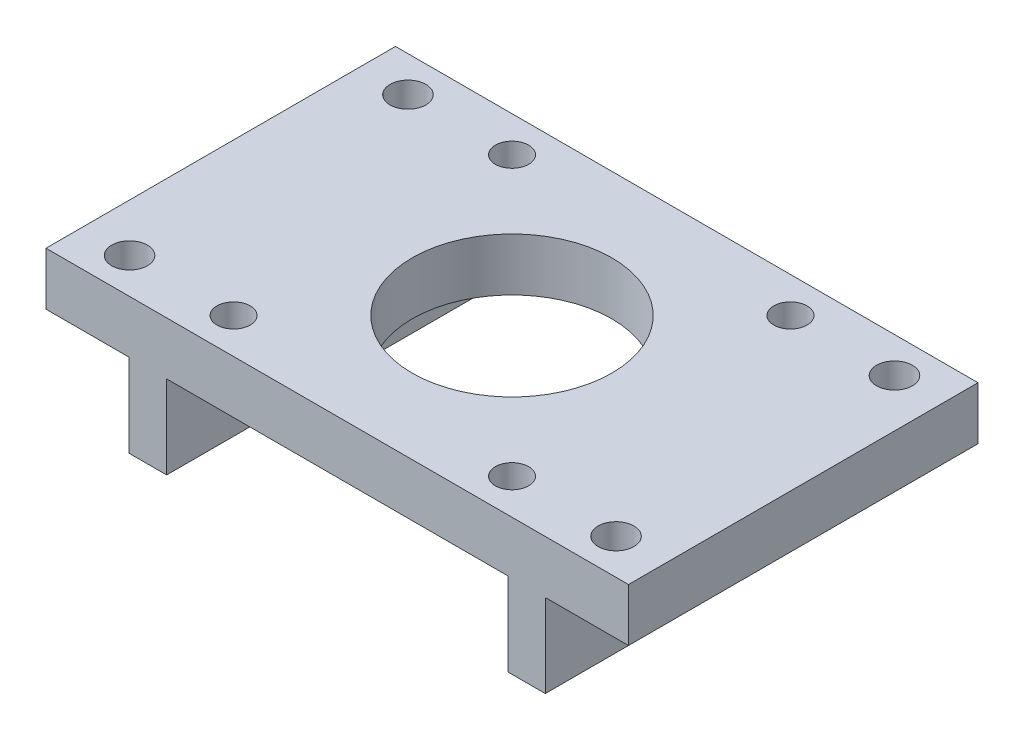
ISO-10303-21;
HEADER;
FILE_DESCRIPTION(('STEP AP214'),'2;1');
FILE_NAME('part.step','',(''),(''),'','','');
FILE_SCHEMA(('AUTOMOTIVE_DESIGN { 1 0 10303 214 1 1 1 1 }'));
ENDSEC;
DATA;
#1=APPLICATION_CONTEXT('core data for automotive mechanical design processes');
#2=APPLICATION_PROTOCOL_DEFINITION('international standard','automotive_design',2000,#1);
#3=PRODUCT_CONTEXT('',#1,'mechanical');
#4=PRODUCT('Part','Part','',(#3));
#5=PRODUCT_RELATED_PRODUCT_CATEGORY('part','',(#4));
#6=PRODUCT_DEFINITION_FORMATION('','',#4);
#7=PRODUCT_DEFINITION_CONTEXT('part definition',#1,'design');
#8=PRODUCT_DEFINITION('design','',#6,#7);
#9=PRODUCT_DEFINITION_SHAPE('','',#8);
#10=(LENGTH_UNIT() NAMED_UNIT(*) SI_UNIT(.MILLI.,.METRE.));
#11=(NAMED_UNIT(*) PLANE_ANGLE_UNIT() SI_UNIT($,.RADIAN.));
#12=(NAMED_UNIT(*) SI_UNIT($,.STERADIAN.) SOLID_ANGLE_UNIT());
#13=UNCERTAINTY_MEASURE_WITH_UNIT(LENGTH_MEASURE(1.E-05),#10,'distance_accuracy_value','');
#14=(GEOMETRIC_REPRESENTATION_CONTEXT(3) GLOBAL_UNCERTAINTY_ASSIGNED_CONTEXT((#13)) GLOBAL_UNIT_ASSIGNED_CONTEXT((#10,
#11,#12)) REPRESENTATION_CONTEXT('',''));
#15=CARTESIAN_POINT('',(0.,0.,0.));
#16=DIRECTION('',(0.,0.,1.));
#17=DIRECTION('',(1.,0.,0.));
#18=AXIS2_PLACEMENT_3D('',#15,#16,#17);
#19=CARTESIAN_POINT('',(0.,-3.175,0.));
#20=DIRECTION('',(0.,1.,0.));
#21=DIRECTION('',(0.,0.,1.));
#22=AXIS2_PLACEMENT_3D('',#19,#20,#21);
#23=PLANE('',#22);
#24=CARTESIAN_POINT('',(29.23,-3.175,-16.73));
#25=DIRECTION('',(0.,1.,0.));
#26=DIRECTION('',(0.,0.,1.));
#27=AXIS2_PLACEMENT_3D('',#24,#25,#26);
#28=CIRCLE('',#27,2.15);
#29=CARTESIAN_POINT('',(29.23,-3.175,-14.58));
#30=VERTEX_POINT('',#29);
#31=EDGE_CURVE('E418',#30,#30,#28,.T.);
#32=ORIENTED_EDGE('',*,*,#31,.T.);
#33=EDGE_LOOP('',(#32));
#34=FACE_BOUND('',#33,.T.);
#35=CARTESIAN_POINT('',(29.23,-3.175,16.73));
#36=DIRECTION('',(0.,1.,0.));
#37=DIRECTION('',(0.,0.,1.));
#38=AXIS2_PLACEMENT_3D('',#35,#36,#37);
#39=CIRCLE('',#38,2.15);
#40=CARTESIAN_POINT('',(29.23,-3.175,18.88));
#41=VERTEX_POINT('',#40);
#42=EDGE_CURVE('E428',#41,#41,#39,.T.);
#43=ORIENTED_EDGE('',*,*,#42,.T.);
#44=EDGE_LOOP('',(#43));
#45=FACE_BOUND('',#44,.T.);
#46=DIRECTION('',(0.,0.,1.));
#47=VECTOR('',#46,1.);
#48=CARTESIAN_POINT('',(25.,-3.175,0.));
#49=LINE('',#48,#47);
#50=CARTESIAN_POINT('',(25.,-3.175,-21.));
#51=VERTEX_POINT('',#50);
#52=CARTESIAN_POINT('',(25.,-3.175,21.));
#53=VERTEX_POINT('',#52);
#54=EDGE_CURVE('E154',#51,#53,#49,.T.);
#55=ORIENTED_EDGE('',*,*,#54,.F.);
#56=DIRECTION('',(-1.,0.,0.));
#57=VECTOR('',#56,1.);
#58=CARTESIAN_POINT('',(35.,-3.175,-21.));
#59=LINE('',#58,#57);
#60=CARTESIAN_POINT('',(35.,-3.175,-21.));
#61=VERTEX_POINT('',#60);
#62=EDGE_CURVE('E214',#61,#51,#59,.T.);
#63=ORIENTED_EDGE('',*,*,#62,.F.);
#64=DIRECTION('',(0.,0.,-1.));
#65=VECTOR('',#64,1.);
#66=CARTESIAN_POINT('',(35.,-3.175,21.));
#67=LINE('',#66,#65);
#68=CARTESIAN_POINT('',(35.,-3.175,21.));
#69=VERTEX_POINT('',#68);
#70=EDGE_CURVE('E232',#69,#61,#67,.T.);
#71=ORIENTED_EDGE('',*,*,#70,.F.);
#72=DIRECTION('',(1.,0.,0.));
#73=VECTOR('',#72,1.);
#74=CARTESIAN_POINT('',(35.,-3.175,21.));
#75=LINE('',#74,#73);
#76=EDGE_CURVE('E227',#53,#69,#75,.T.);
#77=ORIENTED_EDGE('',*,*,#76,.F.);
#78=EDGE_LOOP('',(#55,#63,#71,#77));
#79=FACE_BOUND('',#78,.T.);
#80=ADVANCED_FACE('F39',(#34,#45,#79),#23,.F.);
#81=CARTESIAN_POINT('',(0.,-3.175,0.));
#82=DIRECTION('',(0.,1.,0.));
#83=DIRECTION('',(0.,0.,1.));
#84=AXIS2_PLACEMENT_3D('',#81,#82,#83);
#85=CIRCLE('',#84,12.);
#86=CARTESIAN_POINT('',(0.,-3.175,12.));
#87=VERTEX_POINT('',#86);
#88=EDGE_CURVE('E411',#87,#87,#85,.T.);
#89=ORIENTED_EDGE('',*,*,#88,.T.);
#90=EDGE_LOOP('',(#89));
#91=FACE_BOUND('',#90,.T.);
#92=CARTESIAN_POINT('',(-16.73,-3.175,-16.73));
#93=DIRECTION('',(0.,1.,0.));
#94=DIRECTION('',(0.,0.,1.));
#95=AXIS2_PLACEMENT_3D('',#92,#93,#94);
#96=CIRCLE('',#95,2.);
#97=CARTESIAN_POINT('',(-16.73,-3.175,-14.73));
#98=VERTEX_POINT('',#97);
#99=EDGE_CURVE('E334',#98,#98,#96,.T.);
#100=ORIENTED_EDGE('',*,*,#99,.T.);
#101=EDGE_LOOP('',(#100));
#102=FACE_BOUND('',#101,.T.);
#103=CARTESIAN_POINT('',(16.73,-3.175,-16.73));
#104=DIRECTION('',(0.,1.,0.));
#105=DIRECTION('',(0.,0.,1.));
#106=AXIS2_PLACEMENT_3D('',#103,#104,#105);
#107=CIRCLE('',#106,2.);
#108=CARTESIAN_POINT('',(16.73,-3.175,-14.73));
#109=VERTEX_POINT('',#108);
#110=EDGE_CURVE('E347',#109,#109,#107,.T.);
#111=ORIENTED_EDGE('',*,*,#110,.T.);
#112=EDGE_LOOP('',(#111));
#113=FACE_BOUND('',#112,.T.);
#114=CARTESIAN_POINT('',(16.73,-3.175,16.73));
#115=DIRECTION('',(0.,1.,0.));
#116=DIRECTION('',(0.,0.,1.));
#117=AXIS2_PLACEMENT_3D('',#114,#115,#116);
#118=CIRCLE('',#117,2.);
#119=CARTESIAN_POINT('',(16.73,-3.175,18.73));
#120=VERTEX_POINT('',#119);
#121=EDGE_CURVE('E355',#120,#120,#118,.T.);
#122=ORIENTED_EDGE('',*,*,#121,.T.);
#123=EDGE_LOOP('',(#122));
#124=FACE_BOUND('',#123,.T.);
#125=CARTESIAN_POINT('',(-16.73,-3.175,16.73));
#126=DIRECTION('',(0.,1.,0.));
#127=DIRECTION('',(0.,0.,1.));
#128=AXIS2_PLACEMENT_3D('',#125,#126,#127);
#129=CIRCLE('',#128,2.);
#130=CARTESIAN_POINT('',(-16.73,-3.175,18.73));
#131=VERTEX_POINT('',#130);
#132=EDGE_CURVE('E159',#131,#131,#129,.T.);
#133=ORIENTED_EDGE('',*,*,#132,.T.);
#134=EDGE_LOOP('',(#133));
#135=FACE_BOUND('',#134,.T.);
#136=CARTESIAN_POINT('',(20.5,-3.175,-21.));
#137=VERTEX_POINT('',#136);
#138=CARTESIAN_POINT('',(-20.5,-3.175,-21.));
#139=VERTEX_POINT('',#138);
#140=EDGE_CURVE('E239',#137,#139,#59,.T.);
#141=ORIENTED_EDGE('',*,*,#140,.F.);
#142=DIRECTION('',(0.,0.,1.));
#143=VECTOR('',#142,1.);
#144=CARTESIAN_POINT('',(20.5,-3.175,0.));
#145=LINE('',#144,#143);
#146=CARTESIAN_POINT('',(20.5,-3.175,21.));
#147=VERTEX_POINT('',#146);
#148=EDGE_CURVE('E55',#137,#147,#145,.T.);
#149=ORIENTED_EDGE('',*,*,#148,.T.);
#150=CARTESIAN_POINT('',(-20.5,-3.175,21.));
#151=VERTEX_POINT('',#150);
#152=EDGE_CURVE('E233',#151,#147,#75,.T.);
#153=ORIENTED_EDGE('',*,*,#152,.F.);
#154=DIRECTION('',(0.,0.,-1.));
#155=VECTOR('',#154,1.);
#156=CARTESIAN_POINT('',(-20.5,-3.175,0.));
#157=LINE('',#156,#155);
#158=EDGE_CURVE('E137',#151,#139,#157,.T.);
#159=ORIENTED_EDGE('',*,*,#158,.T.);
#160=EDGE_LOOP('',(#141,#149,#153,#159));
#161=FACE_BOUND('',#160,.T.);
#162=ADVANCED_FACE('F285',(#91,#102,#113,#124,#135,#161),#23,.F.);
#163=CARTESIAN_POINT('',(-35.,3.175,21.));
#164=DIRECTION('',(1.,0.,0.));
#165=DIRECTION('',(0.,0.,-1.));
#166=AXIS2_PLACEMENT_3D('',#163,#164,#165);
#167=PLANE('',#166);
#168=DIRECTION('',(0.,0.,1.));
#169=VECTOR('',#168,1.);
#170=CARTESIAN_POINT('',(-35.,-3.175,21.));
#171=LINE('',#170,#169);
#172=CARTESIAN_POINT('',(-35.,-3.175,-21.));
#173=VERTEX_POINT('',#172);
#174=CARTESIAN_POINT('',(-35.,-3.175,21.));
#175=VERTEX_POINT('',#174);
#176=EDGE_CURVE('E208',#173,#175,#171,.T.);
#177=ORIENTED_EDGE('',*,*,#176,.T.);
#178=DIRECTION('',(0.,-1.,0.));
#179=VECTOR('',#178,1.);
#180=CARTESIAN_POINT('',(-35.,3.175,21.));
#181=LINE('',#180,#179);
#182=CARTESIAN_POINT('',(-35.,3.175,21.));
#183=VERTEX_POINT('',#182);
#184=EDGE_CURVE('E11',#183,#175,#181,.T.);
#185=ORIENTED_EDGE('',*,*,#184,.F.);
#186=DIRECTION('',(0.,0.,1.));
#187=VECTOR('',#186,1.);
#188=CARTESIAN_POINT('',(-35.,3.175,21.));
#189=LINE('',#188,#187);
#190=CARTESIAN_POINT('',(-35.,3.175,-21.));
#191=VERTEX_POINT('',#190);
#192=EDGE_CURVE('E209',#191,#183,#189,.T.);
#193=ORIENTED_EDGE('',*,*,#192,.F.);
#194=DIRECTION('',(0.,-1.,0.));
#195=VECTOR('',#194,1.);
#196=CARTESIAN_POINT('',(-35.,3.175,-21.));
#197=LINE('',#196,#195);
#198=EDGE_CURVE('E223',#191,#173,#197,.T.);
#199=ORIENTED_EDGE('',*,*,#198,.T.);
#200=EDGE_LOOP('',(#177,#185,#193,#199));
#201=FACE_BOUND('',#200,.T.);
#202=ADVANCED_FACE('F41',(#201),#167,.F.);
#203=CARTESIAN_POINT('',(35.,3.175,21.));
#204=DIRECTION('',(0.,0.,-1.));
#205=DIRECTION('',(-1.,0.,0.));
#206=AXIS2_PLACEMENT_3D('',#203,#204,#205);
#207=PLANE('',#206);
#208=CARTESIAN_POINT('',(-25.,-3.175,21.));
#209=VERTEX_POINT('',#208);
#210=EDGE_CURVE('E228',#175,#209,#75,.T.);
#211=ORIENTED_EDGE('',*,*,#210,.T.);
#212=DIRECTION('',(0.,1.,0.));
#213=VECTOR('',#212,1.);
#214=CARTESIAN_POINT('',(-25.,-13.175,21.));
#215=LINE('',#214,#213);
#216=CARTESIAN_POINT('',(-25.,-13.175,21.));
#217=VERTEX_POINT('',#216);
#218=EDGE_CURVE('E63',#217,#209,#215,.T.);
#219=ORIENTED_EDGE('',*,*,#218,.F.);
#220=DIRECTION('',(-1.,0.,0.));
#221=VECTOR('',#220,1.);
#222=CARTESIAN_POINT('',(0.,-13.175,21.));
#223=LINE('',#222,#221);
#224=CARTESIAN_POINT('',(-20.5,-13.175,21.));
#225=VERTEX_POINT('',#224);
#226=EDGE_CURVE('E181',#225,#217,#223,.T.);
#227=ORIENTED_EDGE('',*,*,#226,.F.);
#228=DIRECTION('',(0.,1.,0.));
#229=VECTOR('',#228,1.);
#230=CARTESIAN_POINT('',(-20.5,-13.175,21.));
#231=LINE('',#230,#229);
#232=EDGE_CURVE('E205',#225,#151,#231,.T.);
#233=ORIENTED_EDGE('',*,*,#232,.T.);
#234=ORIENTED_EDGE('',*,*,#152,.T.);
#235=DIRECTION('',(0.,1.,0.));
#236=VECTOR('',#235,1.);
#237=CARTESIAN_POINT('',(20.5,-13.175,21.));
#238=LINE('',#237,#236);
#239=CARTESIAN_POINT('',(20.5,-13.175,21.));
#240=VERTEX_POINT('',#239);
#241=EDGE_CURVE('E166',#240,#147,#238,.T.);
#242=ORIENTED_EDGE('',*,*,#241,.F.);
#243=DIRECTION('',(-1.,0.,0.));
#244=VECTOR('',#243,1.);
#245=CARTESIAN_POINT('',(0.,-13.175,21.));
#246=LINE('',#245,#244);
#247=CARTESIAN_POINT('',(25.,-13.175,21.));
#248=VERTEX_POINT('',#247);
#249=EDGE_CURVE('E151',#248,#240,#246,.T.);
#250=ORIENTED_EDGE('',*,*,#249,.F.);
#251=DIRECTION('',(0.,1.,0.));
#252=VECTOR('',#251,1.);
#253=CARTESIAN_POINT('',(25.,-13.175,21.));
#254=LINE('',#253,#252);
#255=EDGE_CURVE('E171',#248,#53,#254,.T.);
#256=ORIENTED_EDGE('',*,*,#255,.T.);
#257=ORIENTED_EDGE('',*,*,#76,.T.);
#258=DIRECTION('',(0.,-1.,0.));
#259=VECTOR('',#258,1.);
#260=CARTESIAN_POINT('',(35.,3.175,21.));
#261=LINE('',#260,#259);
#262=CARTESIAN_POINT('',(35.,3.175,21.));
#263=VERTEX_POINT('',#262);
#264=EDGE_CURVE('E48',#263,#69,#261,.T.);
#265=ORIENTED_EDGE('',*,*,#264,.F.);
#266=DIRECTION('',(1.,0.,0.));
#267=VECTOR('',#266,1.);
#268=CARTESIAN_POINT('',(35.,3.175,21.));
#269=LINE('',#268,#267);
#270=EDGE_CURVE('E213',#183,#263,#269,.T.);
#271=ORIENTED_EDGE('',*,*,#270,.F.);
#272=ORIENTED_EDGE('',*,*,#184,.T.);
#273=EDGE_LOOP('',(#211,#219,#227,#233,#234,#242,#250,#256,#257,#265,#271,#272));
#274=FACE_BOUND('',#273,.T.);
#275=ADVANCED_FACE('F265',(#274),#207,.F.);
#276=CARTESIAN_POINT('',(35.,3.175,21.));
#277=DIRECTION('',(-1.,0.,0.));
#278=DIRECTION('',(0.,0.,1.));
#279=AXIS2_PLACEMENT_3D('',#276,#277,#278);
#280=PLANE('',#279);
#281=ORIENTED_EDGE('',*,*,#70,.T.);
#282=DIRECTION('',(0.,-1.,0.));
#283=VECTOR('',#282,1.);
#284=CARTESIAN_POINT('',(35.,3.175,-21.));
#285=LINE('',#284,#283);
#286=CARTESIAN_POINT('',(35.,3.175,-21.));
#287=VERTEX_POINT('',#286);
#288=EDGE_CURVE('E243',#287,#61,#285,.T.);
#289=ORIENTED_EDGE('',*,*,#288,.F.);
#290=DIRECTION('',(0.,0.,-1.));
#291=VECTOR('',#290,1.);
#292=CARTESIAN_POINT('',(35.,3.175,21.));
#293=LINE('',#292,#291);
#294=EDGE_CURVE('E217',#263,#287,#293,.T.);
#295=ORIENTED_EDGE('',*,*,#294,.F.);
#296=ORIENTED_EDGE('',*,*,#264,.T.);
#297=EDGE_LOOP('',(#281,#289,#295,#296));
#298=FACE_BOUND('',#297,.T.);
#299=ADVANCED_FACE('F252',(#298),#280,.F.);
#300=CARTESIAN_POINT('',(35.,3.175,-21.));
#301=DIRECTION('',(0.,0.,1.));
#302=DIRECTION('',(1.,0.,0.));
#303=AXIS2_PLACEMENT_3D('',#300,#301,#302);
#304=PLANE('',#303);
#305=ORIENTED_EDGE('',*,*,#62,.T.);
#306=DIRECTION('',(0.,1.,0.));
#307=VECTOR('',#306,1.);
#308=CARTESIAN_POINT('',(25.,-13.175,-21.));
#309=LINE('',#308,#307);
#310=CARTESIAN_POINT('',(25.,-13.175,-21.));
#311=VERTEX_POINT('',#310);
#312=EDGE_CURVE('E138',#311,#51,#309,.T.);
#313=ORIENTED_EDGE('',*,*,#312,.F.);
#314=DIRECTION('',(1.,0.,0.));
#315=VECTOR('',#314,1.);
#316=CARTESIAN_POINT('',(0.,-13.175,-21.));
#317=LINE('',#316,#315);
#318=CARTESIAN_POINT('',(20.5,-13.175,-21.));
#319=VERTEX_POINT('',#318);
#320=EDGE_CURVE('E141',#319,#311,#317,.T.);
#321=ORIENTED_EDGE('',*,*,#320,.F.);
#322=DIRECTION('',(0.,1.,0.));
#323=VECTOR('',#322,1.);
#324=CARTESIAN_POINT('',(20.5,-13.175,-21.));
#325=LINE('',#324,#323);
#326=EDGE_CURVE('E129',#319,#137,#325,.T.);
#327=ORIENTED_EDGE('',*,*,#326,.T.);
#328=ORIENTED_EDGE('',*,*,#140,.T.);
#329=DIRECTION('',(0.,1.,0.));
#330=VECTOR('',#329,1.);
#331=CARTESIAN_POINT('',(-20.5,-13.175,-21.));
#332=LINE('',#331,#330);
#333=CARTESIAN_POINT('',(-20.5,-13.175,-21.));
#334=VERTEX_POINT('',#333);
#335=EDGE_CURVE('E191',#334,#139,#332,.T.);
#336=ORIENTED_EDGE('',*,*,#335,.F.);
#337=DIRECTION('',(1.,0.,0.));
#338=VECTOR('',#337,1.);
#339=CARTESIAN_POINT('',(0.,-13.175,-21.));
#340=LINE('',#339,#338);
#341=CARTESIAN_POINT('',(-25.,-13.175,-21.));
#342=VERTEX_POINT('',#341);
#343=EDGE_CURVE('E188',#342,#334,#340,.T.);
#344=ORIENTED_EDGE('',*,*,#343,.F.);
#345=DIRECTION('',(0.,1.,0.));
#346=VECTOR('',#345,1.);
#347=CARTESIAN_POINT('',(-25.,-13.175,-21.));
#348=LINE('',#347,#346);
#349=CARTESIAN_POINT('',(-25.,-3.175,-21.));
#350=VERTEX_POINT('',#349);
#351=EDGE_CURVE('E200',#342,#350,#348,.T.);
#352=ORIENTED_EDGE('',*,*,#351,.T.);
#353=EDGE_CURVE('E236',#350,#173,#59,.T.);
#354=ORIENTED_EDGE('',*,*,#353,.T.);
#355=ORIENTED_EDGE('',*,*,#198,.F.);
#356=DIRECTION('',(-1.,0.,0.));
#357=VECTOR('',#356,1.);
#358=CARTESIAN_POINT('',(35.,3.175,-21.));
#359=LINE('',#358,#357);
#360=EDGE_CURVE('E220',#287,#191,#359,.T.);
#361=ORIENTED_EDGE('',*,*,#360,.F.);
#362=ORIENTED_EDGE('',*,*,#288,.T.);
#363=EDGE_LOOP('',(#305,#313,#321,#327,#328,#336,#344,#352,#354,#355,#361,#362));
#364=FACE_BOUND('',#363,.T.);
#365=ADVANCED_FACE('F143',(#364),#304,.F.);
#366=CARTESIAN_POINT('',(0.,3.175,0.));
#367=DIRECTION('',(0.,1.,0.));
#368=DIRECTION('',(0.,0.,1.));
#369=AXIS2_PLACEMENT_3D('',#366,#367,#368);
#370=PLANE('',#369);
#371=CARTESIAN_POINT('',(0.,3.175,0.));
#372=DIRECTION('',(0.,1.,0.));
#373=DIRECTION('',(0.,0.,1.));
#374=AXIS2_PLACEMENT_3D('',#371,#372,#373);
#375=CIRCLE('',#374,12.);
#376=CARTESIAN_POINT('',(0.,3.175,12.));
#377=VERTEX_POINT('',#376);
#378=EDGE_CURVE('E408',#377,#377,#375,.T.);
#379=ORIENTED_EDGE('',*,*,#378,.F.);
#380=EDGE_LOOP('',(#379));
#381=FACE_BOUND('',#380,.T.);
#382=CARTESIAN_POINT('',(29.23,3.175,-16.73));
#383=DIRECTION('',(0.,1.,0.));
#384=DIRECTION('',(0.,0.,1.));
#385=AXIS2_PLACEMENT_3D('',#382,#383,#384);
#386=CIRCLE('',#385,2.15);
#387=CARTESIAN_POINT('',(29.23,3.175,-14.58));
#388=VERTEX_POINT('',#387);
#389=EDGE_CURVE('E413',#388,#388,#386,.T.);
#390=ORIENTED_EDGE('',*,*,#389,.F.);
#391=EDGE_LOOP('',(#390));
#392=FACE_BOUND('',#391,.T.);
#393=CARTESIAN_POINT('',(29.23,3.175,16.73));
#394=DIRECTION('',(0.,1.,0.));
#395=DIRECTION('',(0.,0.,1.));
#396=AXIS2_PLACEMENT_3D('',#393,#394,#395);
#397=CIRCLE('',#396,2.15);
#398=CARTESIAN_POINT('',(29.23,3.175,18.88));
#399=VERTEX_POINT('',#398);
#400=EDGE_CURVE('E424',#399,#399,#397,.T.);
#401=ORIENTED_EDGE('',*,*,#400,.F.);
#402=EDGE_LOOP('',(#401));
#403=FACE_BOUND('',#402,.T.);
#404=CARTESIAN_POINT('',(-29.23,3.175,-16.73));
#405=DIRECTION('',(0.,1.,0.));
#406=DIRECTION('',(0.,0.,1.));
#407=AXIS2_PLACEMENT_3D('',#404,#405,#406);
#408=CIRCLE('',#407,2.15);
#409=CARTESIAN_POINT('',(-29.23,3.175,-14.58));
#410=VERTEX_POINT('',#409);
#411=EDGE_CURVE('E432',#410,#410,#408,.T.);
#412=ORIENTED_EDGE('',*,*,#411,.F.);
#413=EDGE_LOOP('',(#412));
#414=FACE_BOUND('',#413,.T.);
#415=CARTESIAN_POINT('',(-29.23,3.175,16.73));
#416=DIRECTION('',(0.,1.,0.));
#417=DIRECTION('',(0.,0.,1.));
#418=AXIS2_PLACEMENT_3D('',#415,#416,#417);
#419=CIRCLE('',#418,2.15);
#420=CARTESIAN_POINT('',(-29.23,3.175,18.88));
#421=VERTEX_POINT('',#420);
#422=EDGE_CURVE('E329',#421,#421,#419,.T.);
#423=ORIENTED_EDGE('',*,*,#422,.F.);
#424=EDGE_LOOP('',(#423));
#425=FACE_BOUND('',#424,.T.);
#426=CARTESIAN_POINT('',(-16.73,3.175,-16.73));
#427=DIRECTION('',(0.,1.,0.));
#428=DIRECTION('',(0.,0.,1.));
#429=AXIS2_PLACEMENT_3D('',#426,#427,#428);
#430=CIRCLE('',#429,2.);
#431=CARTESIAN_POINT('',(-16.73,3.175,-14.73));
#432=VERTEX_POINT('',#431);
#433=EDGE_CURVE('E328',#432,#432,#430,.T.);
#434=ORIENTED_EDGE('',*,*,#433,.F.);
#435=EDGE_LOOP('',(#434));
#436=FACE_BOUND('',#435,.T.);
#437=CARTESIAN_POINT('',(16.73,3.175,-16.73));
#438=DIRECTION('',(0.,1.,0.));
#439=DIRECTION('',(0.,0.,1.));
#440=AXIS2_PLACEMENT_3D('',#437,#438,#439);
#441=CIRCLE('',#440,2.);
#442=CARTESIAN_POINT('',(16.73,3.175,-14.73));
#443=VERTEX_POINT('',#442);
#444=EDGE_CURVE('E343',#443,#443,#441,.T.);
#445=ORIENTED_EDGE('',*,*,#444,.F.);
#446=EDGE_LOOP('',(#445));
#447=FACE_BOUND('',#446,.T.);
#448=CARTESIAN_POINT('',(16.73,3.175,16.73));
#449=DIRECTION('',(0.,1.,0.));
#450=DIRECTION('',(0.,0.,1.));
#451=AXIS2_PLACEMENT_3D('',#448,#449,#450);
#452=CIRCLE('',#451,2.);
#453=CARTESIAN_POINT('',(16.73,3.175,18.73));
#454=VERTEX_POINT('',#453);
#455=EDGE_CURVE('E351',#454,#454,#452,.T.);
#456=ORIENTED_EDGE('',*,*,#455,.F.);
#457=EDGE_LOOP('',(#456));
#458=FACE_BOUND('',#457,.T.);
#459=CARTESIAN_POINT('',(-16.73,3.175,16.73));
#460=DIRECTION('',(0.,1.,0.));
#461=DIRECTION('',(0.,0.,1.));
#462=AXIS2_PLACEMENT_3D('',#459,#460,#461);
#463=CIRCLE('',#462,2.);
#464=CARTESIAN_POINT('',(-16.73,3.175,18.73));
#465=VERTEX_POINT('',#464);
#466=EDGE_CURVE('E358',#465,#465,#463,.T.);
#467=ORIENTED_EDGE('',*,*,#466,.F.);
#468=EDGE_LOOP('',(#467));
#469=FACE_BOUND('',#468,.T.);
#470=ORIENTED_EDGE('',*,*,#192,.T.);
#471=ORIENTED_EDGE('',*,*,#270,.T.);
#472=ORIENTED_EDGE('',*,*,#294,.T.);
#473=ORIENTED_EDGE('',*,*,#360,.T.);
#474=EDGE_LOOP('',(#470,#471,#472,#473));
#475=FACE_BOUND('',#474,.T.);
#476=ADVANCED_FACE('F263',(#381,#392,#403,#414,#425,#436,#447,#458,#469,#475),#370,.T.);
#477=CARTESIAN_POINT('',(-29.23,-3.175,-16.73));
#478=DIRECTION('',(0.,1.,0.));
#479=DIRECTION('',(0.,0.,1.));
#480=AXIS2_PLACEMENT_3D('',#477,#478,#479);
#481=CIRCLE('',#480,2.15);
#482=CARTESIAN_POINT('',(-29.23,-3.175,-14.58));
#483=VERTEX_POINT('',#482);
#484=EDGE_CURVE('E322',#483,#483,#481,.T.);
#485=ORIENTED_EDGE('',*,*,#484,.T.);
#486=EDGE_LOOP('',(#485));
#487=FACE_BOUND('',#486,.T.);
#488=CARTESIAN_POINT('',(-29.23,-3.175,16.73));
#489=DIRECTION('',(0.,1.,0.));
#490=DIRECTION('',(0.,0.,1.));
#491=AXIS2_PLACEMENT_3D('',#488,#489,#490);
#492=CIRCLE('',#491,2.15);
#493=CARTESIAN_POINT('',(-29.23,-3.175,18.88));
#494=VERTEX_POINT('',#493);
#495=EDGE_CURVE('E325',#494,#494,#492,.T.);
#496=ORIENTED_EDGE('',*,*,#495,.T.);
#497=EDGE_LOOP('',(#496));
#498=FACE_BOUND('',#497,.T.);
#499=ORIENTED_EDGE('',*,*,#353,.F.);
#500=DIRECTION('',(0.,0.,1.));
#501=VECTOR('',#500,1.);
#502=CARTESIAN_POINT('',(-25.,-3.175,0.));
#503=LINE('',#502,#501);
#504=EDGE_CURVE('E182',#350,#209,#503,.T.);
#505=ORIENTED_EDGE('',*,*,#504,.T.);
#506=ORIENTED_EDGE('',*,*,#210,.F.);
#507=ORIENTED_EDGE('',*,*,#176,.F.);
#508=EDGE_LOOP('',(#499,#505,#506,#507));
#509=FACE_BOUND('',#508,.T.);
#510=ADVANCED_FACE('F270',(#487,#498,#509),#23,.F.);
#511=CARTESIAN_POINT('',(-20.5,-13.175,0.));
#512=DIRECTION('',(1.,0.,0.));
#513=DIRECTION('',(0.,0.,-1.));
#514=AXIS2_PLACEMENT_3D('',#511,#512,#513);
#515=PLANE('',#514);
#516=ORIENTED_EDGE('',*,*,#158,.F.);
#517=ORIENTED_EDGE('',*,*,#232,.F.);
#518=DIRECTION('',(0.,0.,-1.));
#519=VECTOR('',#518,1.);
#520=CARTESIAN_POINT('',(-20.5,-13.175,0.));
#521=LINE('',#520,#519);
#522=EDGE_CURVE('E177',#225,#334,#521,.T.);
#523=ORIENTED_EDGE('',*,*,#522,.T.);
#524=ORIENTED_EDGE('',*,*,#335,.T.);
#525=EDGE_LOOP('',(#516,#517,#523,#524));
#526=FACE_BOUND('',#525,.T.);
#527=ADVANCED_FACE('F283',(#526),#515,.T.);
#528=CARTESIAN_POINT('',(-25.,-13.175,0.));
#529=DIRECTION('',(-1.,0.,0.));
#530=DIRECTION('',(0.,0.,1.));
#531=AXIS2_PLACEMENT_3D('',#528,#529,#530);
#532=PLANE('',#531);
#533=ORIENTED_EDGE('',*,*,#504,.F.);
#534=ORIENTED_EDGE('',*,*,#351,.F.);
#535=DIRECTION('',(0.,0.,1.));
#536=VECTOR('',#535,1.);
#537=CARTESIAN_POINT('',(-25.,-13.175,0.));
#538=LINE('',#537,#536);
#539=EDGE_CURVE('E185',#342,#217,#538,.T.);
#540=ORIENTED_EDGE('',*,*,#539,.T.);
#541=ORIENTED_EDGE('',*,*,#218,.T.);
#542=EDGE_LOOP('',(#533,#534,#540,#541));
#543=FACE_BOUND('',#542,.T.);
#544=ADVANCED_FACE('F271',(#543),#532,.T.);
#545=CARTESIAN_POINT('',(0.,-13.175,0.));
#546=DIRECTION('',(0.,-1.,0.));
#547=DIRECTION('',(0.,0.,-1.));
#548=AXIS2_PLACEMENT_3D('',#545,#546,#547);
#549=PLANE('',#548);
#550=ORIENTED_EDGE('',*,*,#522,.F.);
#551=ORIENTED_EDGE('',*,*,#226,.T.);
#552=ORIENTED_EDGE('',*,*,#539,.F.);
#553=ORIENTED_EDGE('',*,*,#343,.T.);
#554=EDGE_LOOP('',(#550,#551,#552,#553));
#555=FACE_BOUND('',#554,.T.);
#556=ADVANCED_FACE('F277',(#555),#549,.T.);
#557=CARTESIAN_POINT('',(20.5,-13.175,0.));
#558=DIRECTION('',(-1.,0.,0.));
#559=DIRECTION('',(0.,0.,1.));
#560=AXIS2_PLACEMENT_3D('',#557,#558,#559);
#561=PLANE('',#560);
#562=ORIENTED_EDGE('',*,*,#148,.F.);
#563=ORIENTED_EDGE('',*,*,#326,.F.);
#564=DIRECTION('',(0.,0.,1.));
#565=VECTOR('',#564,1.);
#566=CARTESIAN_POINT('',(20.5,-13.175,0.));
#567=LINE('',#566,#565);
#568=EDGE_CURVE('E133',#319,#240,#567,.T.);
#569=ORIENTED_EDGE('',*,*,#568,.T.);
#570=ORIENTED_EDGE('',*,*,#241,.T.);
#571=EDGE_LOOP('',(#562,#563,#569,#570));
#572=FACE_BOUND('',#571,.T.);
#573=ADVANCED_FACE('F131',(#572),#561,.T.);
#574=CARTESIAN_POINT('',(25.,-13.175,0.));
#575=DIRECTION('',(-1.,0.,0.));
#576=DIRECTION('',(0.,0.,1.));
#577=AXIS2_PLACEMENT_3D('',#574,#575,#576);
#578=PLANE('',#577);
#579=ORIENTED_EDGE('',*,*,#54,.T.);
#580=ORIENTED_EDGE('',*,*,#255,.F.);
#581=DIRECTION('',(0.,0.,1.));
#582=VECTOR('',#581,1.);
#583=CARTESIAN_POINT('',(25.,-13.175,0.));
#584=LINE('',#583,#582);
#585=EDGE_CURVE('E147',#311,#248,#584,.T.);
#586=ORIENTED_EDGE('',*,*,#585,.F.);
#587=ORIENTED_EDGE('',*,*,#312,.T.);
#588=EDGE_LOOP('',(#579,#580,#586,#587));
#589=FACE_BOUND('',#588,.T.);
#590=ADVANCED_FACE('F290',(#589),#578,.F.);
#591=CARTESIAN_POINT('',(0.,-13.175,0.));
#592=DIRECTION('',(0.,-1.,0.));
#593=DIRECTION('',(0.,0.,-1.));
#594=AXIS2_PLACEMENT_3D('',#591,#592,#593);
#595=PLANE('',#594);
#596=ORIENTED_EDGE('',*,*,#568,.F.);
#597=ORIENTED_EDGE('',*,*,#320,.T.);
#598=ORIENTED_EDGE('',*,*,#585,.T.);
#599=ORIENTED_EDGE('',*,*,#249,.T.);
#600=EDGE_LOOP('',(#596,#597,#598,#599));
#601=FACE_BOUND('',#600,.T.);
#602=ADVANCED_FACE('F149',(#601),#595,.T.);
#603=CARTESIAN_POINT('',(-16.73,3.175,16.73));
#604=DIRECTION('',(0.,1.,0.));
#605=DIRECTION('',(0.,0.,1.));
#606=AXIS2_PLACEMENT_3D('',#603,#604,#605);
#607=CYLINDRICAL_SURFACE('',#606,2.);
#608=ORIENTED_EDGE('',*,*,#132,.F.);
#609=EDGE_LOOP('',(#608));
#610=FACE_BOUND('',#609,.T.);
#611=ORIENTED_EDGE('',*,*,#466,.T.);
#612=EDGE_LOOP('',(#611));
#613=FACE_BOUND('',#612,.T.);
#614=ADVANCED_FACE('F297',(#610,#613),#607,.F.);
#615=CARTESIAN_POINT('',(16.73,3.175,16.73));
#616=DIRECTION('',(0.,1.,0.));
#617=DIRECTION('',(0.,0.,1.));
#618=AXIS2_PLACEMENT_3D('',#615,#616,#617);
#619=CYLINDRICAL_SURFACE('',#618,2.);
#620=ORIENTED_EDGE('',*,*,#121,.F.);
#621=EDGE_LOOP('',(#620));
#622=FACE_BOUND('',#621,.T.);
#623=ORIENTED_EDGE('',*,*,#455,.T.);
#624=EDGE_LOOP('',(#623));
#625=FACE_BOUND('',#624,.T.);
#626=ADVANCED_FACE('F369',(#622,#625),#619,.F.);
#627=CARTESIAN_POINT('',(16.73,3.175,-16.73));
#628=DIRECTION('',(0.,1.,0.));
#629=DIRECTION('',(0.,0.,1.));
#630=AXIS2_PLACEMENT_3D('',#627,#628,#629);
#631=CYLINDRICAL_SURFACE('',#630,2.);
#632=ORIENTED_EDGE('',*,*,#110,.F.);
#633=EDGE_LOOP('',(#632));
#634=FACE_BOUND('',#633,.T.);
#635=ORIENTED_EDGE('',*,*,#444,.T.);
#636=EDGE_LOOP('',(#635));
#637=FACE_BOUND('',#636,.T.);
#638=ADVANCED_FACE('F374',(#634,#637),#631,.F.);
#639=CARTESIAN_POINT('',(-16.73,3.175,-16.73));
#640=DIRECTION('',(0.,1.,0.));
#641=DIRECTION('',(0.,0.,1.));
#642=AXIS2_PLACEMENT_3D('',#639,#640,#641);
#643=CYLINDRICAL_SURFACE('',#642,2.);
#644=ORIENTED_EDGE('',*,*,#99,.F.);
#645=EDGE_LOOP('',(#644));
#646=FACE_BOUND('',#645,.T.);
#647=ORIENTED_EDGE('',*,*,#433,.T.);
#648=EDGE_LOOP('',(#647));
#649=FACE_BOUND('',#648,.T.);
#650=ADVANCED_FACE('F380',(#646,#649),#643,.F.);
#651=CARTESIAN_POINT('',(-29.23,3.175,16.73));
#652=DIRECTION('',(0.,1.,0.));
#653=DIRECTION('',(0.,0.,1.));
#654=AXIS2_PLACEMENT_3D('',#651,#652,#653);
#655=CYLINDRICAL_SURFACE('',#654,2.15);
#656=ORIENTED_EDGE('',*,*,#495,.F.);
#657=EDGE_LOOP('',(#656));
#658=FACE_BOUND('',#657,.T.);
#659=ORIENTED_EDGE('',*,*,#422,.T.);
#660=EDGE_LOOP('',(#659));
#661=FACE_BOUND('',#660,.T.);
#662=ADVANCED_FACE('F384',(#658,#661),#655,.F.);
#663=CARTESIAN_POINT('',(-29.23,3.175,-16.73));
#664=DIRECTION('',(0.,1.,0.));
#665=DIRECTION('',(0.,0.,1.));
#666=AXIS2_PLACEMENT_3D('',#663,#664,#665);
#667=CYLINDRICAL_SURFACE('',#666,2.15);
#668=ORIENTED_EDGE('',*,*,#484,.F.);
#669=EDGE_LOOP('',(#668));
#670=FACE_BOUND('',#669,.T.);
#671=ORIENTED_EDGE('',*,*,#411,.T.);
#672=EDGE_LOOP('',(#671));
#673=FACE_BOUND('',#672,.T.);
#674=ADVANCED_FACE('F388',(#670,#673),#667,.F.);
#675=CARTESIAN_POINT('',(29.23,3.175,16.73));
#676=DIRECTION('',(0.,1.,0.));
#677=DIRECTION('',(0.,0.,1.));
#678=AXIS2_PLACEMENT_3D('',#675,#676,#677);
#679=CYLINDRICAL_SURFACE('',#678,2.15);
#680=ORIENTED_EDGE('',*,*,#42,.F.);
#681=EDGE_LOOP('',(#680));
#682=FACE_BOUND('',#681,.T.);
#683=ORIENTED_EDGE('',*,*,#400,.T.);
#684=EDGE_LOOP('',(#683));
#685=FACE_BOUND('',#684,.T.);
#686=ADVANCED_FACE('F391',(#682,#685),#679,.F.);
#687=CARTESIAN_POINT('',(29.23,3.175,-16.73));
#688=DIRECTION('',(0.,1.,0.));
#689=DIRECTION('',(0.,0.,1.));
#690=AXIS2_PLACEMENT_3D('',#687,#688,#689);
#691=CYLINDRICAL_SURFACE('',#690,2.15);
#692=ORIENTED_EDGE('',*,*,#31,.F.);
#693=EDGE_LOOP('',(#692));
#694=FACE_BOUND('',#693,.T.);
#695=ORIENTED_EDGE('',*,*,#389,.T.);
#696=EDGE_LOOP('',(#695));
#697=FACE_BOUND('',#696,.T.);
#698=ADVANCED_FACE('F395',(#694,#697),#691,.F.);
#699=CARTESIAN_POINT('',(0.,-13.175,0.));
#700=DIRECTION('',(0.,1.,0.));
#701=DIRECTION('',(0.,0.,1.));
#702=AXIS2_PLACEMENT_3D('',#699,#700,#701);
#703=CYLINDRICAL_SURFACE('',#702,12.);
#704=ORIENTED_EDGE('',*,*,#378,.T.);
#705=EDGE_LOOP('',(#704));
#706=FACE_BOUND('',#705,.T.);
#707=ORIENTED_EDGE('',*,*,#88,.F.);
#708=EDGE_LOOP('',(#707));
#709=FACE_BOUND('',#708,.T.);
#710=ADVANCED_FACE('F399',(#706,#709),#703,.F.);
#711=CLOSED_SHELL('',(#80,#162,#202,#275,#299,#365,#476,#510,#527,#544,#556,#573,#590,#602,#614,
#626,#638,#650,#662,#674,#686,#698,#710));
#712=MANIFOLD_SOLID_BREP('B2',#711);
#713=ADVANCED_BREP_SHAPE_REPRESENTATION('',(#18,#712),#14);
#714=SHAPE_DEFINITION_REPRESENTATION(#9,#713);
ENDSEC;
END-ISO-10303-21;
